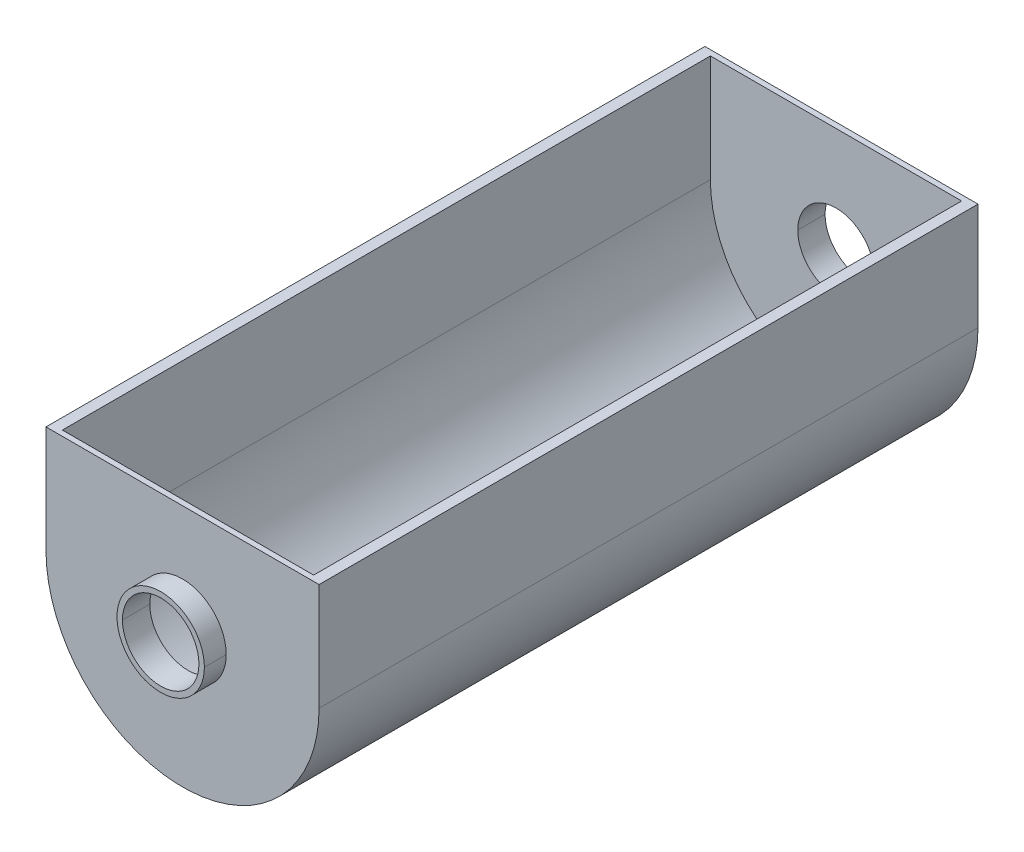
ISO-10303-21;
HEADER;
FILE_DESCRIPTION(('STEP AP214'),'2;1');
FILE_NAME('part.step','',(''),(''),'','','');
FILE_SCHEMA(('AUTOMOTIVE_DESIGN { 1 0 10303 214 1 1 1 1 }'));
ENDSEC;
DATA;
#1=APPLICATION_CONTEXT('core data for automotive mechanical design processes');
#2=APPLICATION_PROTOCOL_DEFINITION('international standard','automotive_design',2000,#1);
#3=PRODUCT_CONTEXT('',#1,'mechanical');
#4=PRODUCT('Part','Part','',(#3));
#5=PRODUCT_RELATED_PRODUCT_CATEGORY('part','',(#4));
#6=PRODUCT_DEFINITION_FORMATION('','',#4);
#7=PRODUCT_DEFINITION_CONTEXT('part definition',#1,'design');
#8=PRODUCT_DEFINITION('design','',#6,#7);
#9=PRODUCT_DEFINITION_SHAPE('','',#8);
#10=(LENGTH_UNIT() NAMED_UNIT(*) SI_UNIT(.MILLI.,.METRE.));
#11=(NAMED_UNIT(*) PLANE_ANGLE_UNIT() SI_UNIT($,.RADIAN.));
#12=(NAMED_UNIT(*) SI_UNIT($,.STERADIAN.) SOLID_ANGLE_UNIT());
#13=UNCERTAINTY_MEASURE_WITH_UNIT(LENGTH_MEASURE(1.E-05),#10,'distance_accuracy_value','');
#14=(GEOMETRIC_REPRESENTATION_CONTEXT(3) GLOBAL_UNCERTAINTY_ASSIGNED_CONTEXT((#13)) GLOBAL_UNIT_ASSIGNED_CONTEXT((#10,
#11,#12)) REPRESENTATION_CONTEXT('',''));
#15=CARTESIAN_POINT('',(0.,0.,0.));
#16=DIRECTION('',(0.,0.,1.));
#17=DIRECTION('',(1.,0.,0.));
#18=AXIS2_PLACEMENT_3D('',#15,#16,#17);
#19=CARTESIAN_POINT('',(0.,0.,-603.25));
#20=DIRECTION('',(0.,0.,-1.));
#21=DIRECTION('',(0.,-1.,0.));
#22=AXIS2_PLACEMENT_3D('',#19,#20,#21);
#23=PLANE('',#22);
#24=CARTESIAN_POINT('',(0.,0.,-603.25));
#25=DIRECTION('',(0.,0.,-1.));
#26=DIRECTION('',(1.,0.,0.));
#27=AXIS2_PLACEMENT_3D('',#24,#25,#26);
#28=CIRCLE('',#27,40.);
#29=CARTESIAN_POINT('',(40.,0.,-603.25));
#30=VERTEX_POINT('',#29);
#31=CARTESIAN_POINT('',(-40.,0.,-603.25));
#32=VERTEX_POINT('',#31);
#33=EDGE_CURVE('E134',#30,#32,#28,.T.);
#34=ORIENTED_EDGE('',*,*,#33,.F.);
#35=CARTESIAN_POINT('',(0.,0.,-603.25));
#36=DIRECTION('',(0.,0.,-1.));
#37=DIRECTION('',(1.,0.,0.));
#38=AXIS2_PLACEMENT_3D('',#35,#36,#37);
#39=CIRCLE('',#38,40.);
#40=EDGE_CURVE('E112',#32,#30,#39,.T.);
#41=ORIENTED_EDGE('',*,*,#40,.F.);
#42=EDGE_LOOP('',(#34,#41));
#43=FACE_BOUND('',#42,.T.);
#44=DIRECTION('',(0.,-1.,0.));
#45=VECTOR('',#44,1.);
#46=CARTESIAN_POINT('',(125.,0.,-603.25));
#47=LINE('',#46,#45);
#48=CARTESIAN_POINT('',(125.,98.0396050857446,-603.25));
#49=VERTEX_POINT('',#48);
#50=CARTESIAN_POINT('',(125.,0.,-603.25));
#51=VERTEX_POINT('',#50);
#52=EDGE_CURVE('E196',#49,#51,#47,.T.);
#53=ORIENTED_EDGE('',*,*,#52,.T.);
#54=CARTESIAN_POINT('',(0.,0.,-603.25));
#55=DIRECTION('',(0.,0.,1.));
#56=DIRECTION('',(1.,0.,0.));
#57=AXIS2_PLACEMENT_3D('',#54,#55,#56);
#58=CIRCLE('',#57,125.);
#59=CARTESIAN_POINT('',(-125.,0.,-603.25));
#60=VERTEX_POINT('',#59);
#61=EDGE_CURVE('E175',#60,#51,#58,.T.);
#62=ORIENTED_EDGE('',*,*,#61,.F.);
#63=DIRECTION('',(0.,-1.,0.));
#64=VECTOR('',#63,1.);
#65=CARTESIAN_POINT('',(-125.,0.,-603.25));
#66=LINE('',#65,#64);
#67=CARTESIAN_POINT('',(-125.,98.0396050857446,-603.25));
#68=VERTEX_POINT('',#67);
#69=EDGE_CURVE('E206',#68,#60,#66,.T.);
#70=ORIENTED_EDGE('',*,*,#69,.F.);
#71=DIRECTION('',(1.,0.,0.));
#72=VECTOR('',#71,1.);
#73=CARTESIAN_POINT('',(0.,98.0396050857446,-603.25));
#74=LINE('',#73,#72);
#75=EDGE_CURVE('E203',#68,#49,#74,.T.);
#76=ORIENTED_EDGE('',*,*,#75,.T.);
#77=EDGE_LOOP('',(#53,#62,#70,#76));
#78=FACE_BOUND('',#77,.T.);
#79=ADVANCED_FACE('F15',(#43,#78),#23,.T.);
#80=CARTESIAN_POINT('',(0.,0.,-623.25));
#81=DIRECTION('',(0.,0.,-1.));
#82=DIRECTION('',(0.,-1.,0.));
#83=AXIS2_PLACEMENT_3D('',#80,#81,#82);
#84=PLANE('',#83);
#85=CARTESIAN_POINT('',(0.,0.,-623.25));
#86=DIRECTION('',(0.,0.,1.));
#87=DIRECTION('',(1.,0.,0.));
#88=AXIS2_PLACEMENT_3D('',#85,#86,#87);
#89=CIRCLE('',#88,35.);
#90=CARTESIAN_POINT('',(35.,0.,-623.25));
#91=VERTEX_POINT('',#90);
#92=CARTESIAN_POINT('',(-35.,0.,-623.25));
#93=VERTEX_POINT('',#92);
#94=EDGE_CURVE('E123',#91,#93,#89,.T.);
#95=ORIENTED_EDGE('',*,*,#94,.T.);
#96=CARTESIAN_POINT('',(0.,0.,-623.25));
#97=DIRECTION('',(0.,0.,1.));
#98=DIRECTION('',(1.,0.,0.));
#99=AXIS2_PLACEMENT_3D('',#96,#97,#98);
#100=CIRCLE('',#99,35.);
#101=EDGE_CURVE('E10',#93,#91,#100,.T.);
#102=ORIENTED_EDGE('',*,*,#101,.T.);
#103=EDGE_LOOP('',(#95,#102));
#104=FACE_BOUND('',#103,.T.);
#105=CARTESIAN_POINT('',(0.,0.,-623.25));
#106=DIRECTION('',(0.,0.,1.));
#107=DIRECTION('',(1.,0.,0.));
#108=AXIS2_PLACEMENT_3D('',#105,#106,#107);
#109=CIRCLE('',#108,40.);
#110=CARTESIAN_POINT('',(40.,0.,-623.25));
#111=VERTEX_POINT('',#110);
#112=CARTESIAN_POINT('',(-40.,0.,-623.25));
#113=VERTEX_POINT('',#112);
#114=EDGE_CURVE('E202',#111,#113,#109,.T.);
#115=ORIENTED_EDGE('',*,*,#114,.F.);
#116=CARTESIAN_POINT('',(0.,0.,-623.25));
#117=DIRECTION('',(0.,0.,1.));
#118=DIRECTION('',(1.,0.,0.));
#119=AXIS2_PLACEMENT_3D('',#116,#117,#118);
#120=CIRCLE('',#119,40.);
#121=EDGE_CURVE('E19',#113,#111,#120,.T.);
#122=ORIENTED_EDGE('',*,*,#121,.F.);
#123=EDGE_LOOP('',(#115,#122));
#124=FACE_BOUND('',#123,.T.);
#125=ADVANCED_FACE('F120',(#104,#124),#84,.T.);
#126=CARTESIAN_POINT('',(0.,0.,-598.25));
#127=DIRECTION('',(0.,0.,-1.));
#128=DIRECTION('',(1.,0.,0.));
#129=AXIS2_PLACEMENT_3D('',#126,#127,#128);
#130=CYLINDRICAL_SURFACE('',#129,35.);
#131=DIRECTION('',(0.,0.,-1.));
#132=VECTOR('',#131,1.);
#133=CARTESIAN_POINT('',(-35.,0.,-598.25));
#134=LINE('',#133,#132);
#135=CARTESIAN_POINT('',(-35.,0.,-598.25));
#136=VERTEX_POINT('',#135);
#137=EDGE_CURVE('E137',#136,#93,#134,.T.);
#138=ORIENTED_EDGE('',*,*,#137,.F.);
#139=CARTESIAN_POINT('',(0.,0.,-598.25));
#140=DIRECTION('',(0.,0.,1.));
#141=DIRECTION('',(1.,0.,0.));
#142=AXIS2_PLACEMENT_3D('',#139,#140,#141);
#143=CIRCLE('',#142,35.);
#144=CARTESIAN_POINT('',(35.,0.,-598.25));
#145=VERTEX_POINT('',#144);
#146=EDGE_CURVE('E26',#136,#145,#143,.T.);
#147=ORIENTED_EDGE('',*,*,#146,.T.);
#148=DIRECTION('',(0.,0.,-1.));
#149=VECTOR('',#148,1.);
#150=CARTESIAN_POINT('',(35.,0.,-598.25));
#151=LINE('',#150,#149);
#152=EDGE_CURVE('E128',#145,#91,#151,.T.);
#153=ORIENTED_EDGE('',*,*,#152,.T.);
#154=ORIENTED_EDGE('',*,*,#101,.F.);
#155=EDGE_LOOP('',(#138,#147,#153,#154));
#156=FACE_BOUND('',#155,.T.);
#157=ADVANCED_FACE('F129',(#156),#130,.F.);
#158=CARTESIAN_POINT('',(0.,0.,-598.25));
#159=DIRECTION('',(0.,0.,-1.));
#160=DIRECTION('',(0.,-1.,0.));
#161=AXIS2_PLACEMENT_3D('',#158,#159,#160);
#162=PLANE('',#161);
#163=CARTESIAN_POINT('',(0.,0.,-598.25));
#164=DIRECTION('',(0.,0.,1.));
#165=DIRECTION('',(1.,0.,0.));
#166=AXIS2_PLACEMENT_3D('',#163,#164,#165);
#167=CIRCLE('',#166,35.);
#168=EDGE_CURVE('E144',#145,#136,#167,.T.);
#169=ORIENTED_EDGE('',*,*,#168,.F.);
#170=ORIENTED_EDGE('',*,*,#146,.F.);
#171=EDGE_LOOP('',(#169,#170));
#172=FACE_BOUND('',#171,.T.);
#173=DIRECTION('',(0.,-1.,0.));
#174=VECTOR('',#173,1.);
#175=CARTESIAN_POINT('',(115.,0.,-598.25));
#176=LINE('',#175,#174);
#177=CARTESIAN_POINT('',(115.,98.0396050857446,-598.25));
#178=VERTEX_POINT('',#177);
#179=CARTESIAN_POINT('',(115.,0.,-598.25));
#180=VERTEX_POINT('',#179);
#181=EDGE_CURVE('E164',#178,#180,#176,.T.);
#182=ORIENTED_EDGE('',*,*,#181,.F.);
#183=DIRECTION('',(1.,0.,0.));
#184=VECTOR('',#183,1.);
#185=CARTESIAN_POINT('',(0.,98.0396050857446,-598.25));
#186=LINE('',#185,#184);
#187=CARTESIAN_POINT('',(-115.,98.0396050857446,-598.25));
#188=VERTEX_POINT('',#187);
#189=EDGE_CURVE('E154',#188,#178,#186,.T.);
#190=ORIENTED_EDGE('',*,*,#189,.F.);
#191=DIRECTION('',(0.,1.,0.));
#192=VECTOR('',#191,1.);
#193=CARTESIAN_POINT('',(-115.,0.,-598.25));
#194=LINE('',#193,#192);
#195=CARTESIAN_POINT('',(-115.,0.,-598.25));
#196=VERTEX_POINT('',#195);
#197=EDGE_CURVE('E160',#196,#188,#194,.T.);
#198=ORIENTED_EDGE('',*,*,#197,.F.);
#199=CARTESIAN_POINT('',(0.,0.,-598.25));
#200=DIRECTION('',(0.,0.,-1.));
#201=DIRECTION('',(-1.,0.,0.));
#202=AXIS2_PLACEMENT_3D('',#199,#200,#201);
#203=CIRCLE('',#202,115.);
#204=EDGE_CURVE('E41',#180,#196,#203,.T.);
#205=ORIENTED_EDGE('',*,*,#204,.F.);
#206=EDGE_LOOP('',(#182,#190,#198,#205));
#207=FACE_BOUND('',#206,.T.);
#208=ADVANCED_FACE('F358',(#172,#207),#162,.F.);
#209=CARTESIAN_POINT('',(0.,0.,-598.25));
#210=DIRECTION('',(0.,0.,-1.));
#211=DIRECTION('',(1.,0.,0.));
#212=AXIS2_PLACEMENT_3D('',#209,#210,#211);
#213=CYLINDRICAL_SURFACE('',#212,40.);
#214=DIRECTION('',(0.,0.,-1.));
#215=VECTOR('',#214,1.);
#216=CARTESIAN_POINT('',(-40.,0.,-598.25));
#217=LINE('',#216,#215);
#218=EDGE_CURVE('E220',#32,#113,#217,.T.);
#219=ORIENTED_EDGE('',*,*,#218,.F.);
#220=ORIENTED_EDGE('',*,*,#40,.T.);
#221=DIRECTION('',(0.,0.,-1.));
#222=VECTOR('',#221,1.);
#223=CARTESIAN_POINT('',(40.,0.,-598.25));
#224=LINE('',#223,#222);
#225=EDGE_CURVE('E150',#30,#111,#224,.T.);
#226=ORIENTED_EDGE('',*,*,#225,.T.);
#227=ORIENTED_EDGE('',*,*,#114,.T.);
#228=EDGE_LOOP('',(#219,#220,#226,#227));
#229=FACE_BOUND('',#228,.T.);
#230=ADVANCED_FACE('F397',(#229),#213,.T.);
#231=CARTESIAN_POINT('',(0.,0.,-933.282334912326));
#232=DIRECTION('',(0.,0.,1.));
#233=DIRECTION('',(1.,0.,0.));
#234=AXIS2_PLACEMENT_3D('',#231,#232,#233);
#235=CYLINDRICAL_SURFACE('',#234,115.);
#236=DIRECTION('',(0.,0.,1.));
#237=VECTOR('',#236,1.);
#238=CARTESIAN_POINT('',(115.,0.,-933.282334912326));
#239=LINE('',#238,#237);
#240=CARTESIAN_POINT('',(115.,0.,-5.));
#241=VERTEX_POINT('',#240);
#242=EDGE_CURVE('E181',#180,#241,#239,.T.);
#243=ORIENTED_EDGE('',*,*,#242,.F.);
#244=ORIENTED_EDGE('',*,*,#204,.T.);
#245=DIRECTION('',(0.,0.,1.));
#246=VECTOR('',#245,1.);
#247=CARTESIAN_POINT('',(-115.,0.,-933.282334912326));
#248=LINE('',#247,#246);
#249=CARTESIAN_POINT('',(-115.,0.,-5.));
#250=VERTEX_POINT('',#249);
#251=EDGE_CURVE('E165',#196,#250,#248,.T.);
#252=ORIENTED_EDGE('',*,*,#251,.T.);
#253=CARTESIAN_POINT('',(0.,0.,-5.));
#254=DIRECTION('',(0.,0.,-1.));
#255=DIRECTION('',(-1.,0.,0.));
#256=AXIS2_PLACEMENT_3D('',#253,#254,#255);
#257=CIRCLE('',#256,115.);
#258=EDGE_CURVE('E265',#241,#250,#257,.T.);
#259=ORIENTED_EDGE('',*,*,#258,.F.);
#260=EDGE_LOOP('',(#243,#244,#252,#259));
#261=FACE_BOUND('',#260,.T.);
#262=ADVANCED_FACE('F428',(#261),#235,.F.);
#263=CARTESIAN_POINT('',(115.,0.,-933.282334912326));
#264=DIRECTION('',(-1.,0.,0.));
#265=DIRECTION('',(0.,0.,1.));
#266=AXIS2_PLACEMENT_3D('',#263,#264,#265);
#267=PLANE('',#266);
#268=DIRECTION('',(0.,0.,1.));
#269=VECTOR('',#268,1.);
#270=CARTESIAN_POINT('',(115.,98.0396050857446,-933.282334912326));
#271=LINE('',#270,#269);
#272=CARTESIAN_POINT('',(115.,98.0396050857446,-5.));
#273=VERTEX_POINT('',#272);
#274=EDGE_CURVE('E158',#178,#273,#271,.T.);
#275=ORIENTED_EDGE('',*,*,#274,.F.);
#276=ORIENTED_EDGE('',*,*,#181,.T.);
#277=ORIENTED_EDGE('',*,*,#242,.T.);
#278=DIRECTION('',(0.,-1.,0.));
#279=VECTOR('',#278,1.);
#280=CARTESIAN_POINT('',(115.,0.,-5.));
#281=LINE('',#280,#279);
#282=EDGE_CURVE('E174',#273,#241,#281,.T.);
#283=ORIENTED_EDGE('',*,*,#282,.F.);
#284=EDGE_LOOP('',(#275,#276,#277,#283));
#285=FACE_BOUND('',#284,.T.);
#286=ADVANCED_FACE('F362',(#285),#267,.T.);
#287=CARTESIAN_POINT('',(-115.,0.,-933.282334912326));
#288=DIRECTION('',(1.,0.,0.));
#289=DIRECTION('',(0.,1.,0.));
#290=AXIS2_PLACEMENT_3D('',#287,#288,#289);
#291=PLANE('',#290);
#292=ORIENTED_EDGE('',*,*,#251,.F.);
#293=ORIENTED_EDGE('',*,*,#197,.T.);
#294=DIRECTION('',(0.,0.,1.));
#295=VECTOR('',#294,1.);
#296=CARTESIAN_POINT('',(-115.,98.0396050857446,-933.282334912326));
#297=LINE('',#296,#295);
#298=CARTESIAN_POINT('',(-115.,98.0396050857446,-5.));
#299=VERTEX_POINT('',#298);
#300=EDGE_CURVE('E227',#188,#299,#297,.T.);
#301=ORIENTED_EDGE('',*,*,#300,.T.);
#302=DIRECTION('',(0.,1.,0.));
#303=VECTOR('',#302,1.);
#304=CARTESIAN_POINT('',(-115.,0.,-5.));
#305=LINE('',#304,#303);
#306=EDGE_CURVE('E148',#250,#299,#305,.T.);
#307=ORIENTED_EDGE('',*,*,#306,.F.);
#308=EDGE_LOOP('',(#292,#293,#301,#307));
#309=FACE_BOUND('',#308,.T.);
#310=ADVANCED_FACE('F350',(#309),#291,.T.);
#311=CARTESIAN_POINT('',(0.,0.,0.));
#312=DIRECTION('',(0.,0.,1.));
#313=DIRECTION('',(1.,0.,0.));
#314=AXIS2_PLACEMENT_3D('',#311,#312,#313);
#315=PLANE('',#314);
#316=CARTESIAN_POINT('',(0.,0.,0.));
#317=DIRECTION('',(0.,0.,-1.));
#318=DIRECTION('',(1.,0.,0.));
#319=AXIS2_PLACEMENT_3D('',#316,#317,#318);
#320=CIRCLE('',#319,40.);
#321=CARTESIAN_POINT('',(40.,0.,0.));
#322=VERTEX_POINT('',#321);
#323=CARTESIAN_POINT('',(-40.,0.,0.));
#324=VERTEX_POINT('',#323);
#325=EDGE_CURVE('E251',#322,#324,#320,.T.);
#326=ORIENTED_EDGE('',*,*,#325,.T.);
#327=CARTESIAN_POINT('',(0.,0.,0.));
#328=DIRECTION('',(0.,0.,-1.));
#329=DIRECTION('',(1.,0.,0.));
#330=AXIS2_PLACEMENT_3D('',#327,#328,#329);
#331=CIRCLE('',#330,40.);
#332=EDGE_CURVE('E237',#324,#322,#331,.T.);
#333=ORIENTED_EDGE('',*,*,#332,.T.);
#334=EDGE_LOOP('',(#326,#333));
#335=FACE_BOUND('',#334,.T.);
#336=DIRECTION('',(0.,-1.,0.));
#337=VECTOR('',#336,1.);
#338=CARTESIAN_POINT('',(125.,0.,0.));
#339=LINE('',#338,#337);
#340=CARTESIAN_POINT('',(125.,98.0396050857446,0.));
#341=VERTEX_POINT('',#340);
#342=CARTESIAN_POINT('',(125.,0.,0.));
#343=VERTEX_POINT('',#342);
#344=EDGE_CURVE('E185',#341,#343,#339,.T.);
#345=ORIENTED_EDGE('',*,*,#344,.F.);
#346=DIRECTION('',(1.,0.,0.));
#347=VECTOR('',#346,1.);
#348=CARTESIAN_POINT('',(0.,98.0396050857446,0.));
#349=LINE('',#348,#347);
#350=CARTESIAN_POINT('',(-125.,98.0396050857446,0.));
#351=VERTEX_POINT('',#350);
#352=EDGE_CURVE('E159',#351,#341,#349,.T.);
#353=ORIENTED_EDGE('',*,*,#352,.F.);
#354=DIRECTION('',(0.,-1.,0.));
#355=VECTOR('',#354,1.);
#356=CARTESIAN_POINT('',(-125.,0.,0.));
#357=LINE('',#356,#355);
#358=CARTESIAN_POINT('',(-125.,0.,0.));
#359=VERTEX_POINT('',#358);
#360=EDGE_CURVE('E179',#351,#359,#357,.T.);
#361=ORIENTED_EDGE('',*,*,#360,.T.);
#362=CARTESIAN_POINT('',(0.,0.,0.));
#363=DIRECTION('',(0.,0.,1.));
#364=DIRECTION('',(1.,0.,0.));
#365=AXIS2_PLACEMENT_3D('',#362,#363,#364);
#366=CIRCLE('',#365,125.);
#367=EDGE_CURVE('E195',#359,#343,#366,.T.);
#368=ORIENTED_EDGE('',*,*,#367,.T.);
#369=EDGE_LOOP('',(#345,#353,#361,#368));
#370=FACE_BOUND('',#369,.T.);
#371=ADVANCED_FACE('F298',(#335,#370),#315,.T.);
#372=CARTESIAN_POINT('',(0.,98.0396050857446,-5.));
#373=DIRECTION('',(0.,-1.,0.));
#374=DIRECTION('',(0.,0.,-1.));
#375=AXIS2_PLACEMENT_3D('',#372,#373,#374);
#376=PLANE('',#375);
#377=ORIENTED_EDGE('',*,*,#189,.T.);
#378=ORIENTED_EDGE('',*,*,#274,.T.);
#379=DIRECTION('',(1.,0.,0.));
#380=VECTOR('',#379,1.);
#381=CARTESIAN_POINT('',(0.,98.0396050857446,-5.));
#382=LINE('',#381,#380);
#383=EDGE_CURVE('E170',#299,#273,#382,.T.);
#384=ORIENTED_EDGE('',*,*,#383,.F.);
#385=ORIENTED_EDGE('',*,*,#300,.F.);
#386=EDGE_LOOP('',(#377,#378,#384,#385));
#387=FACE_BOUND('',#386,.T.);
#388=DIRECTION('',(0.,0.,1.));
#389=VECTOR('',#388,1.);
#390=CARTESIAN_POINT('',(125.,98.0396050857446,-5.));
#391=LINE('',#390,#389);
#392=EDGE_CURVE('E191',#49,#341,#391,.T.);
#393=ORIENTED_EDGE('',*,*,#392,.F.);
#394=ORIENTED_EDGE('',*,*,#75,.F.);
#395=DIRECTION('',(0.,0.,1.));
#396=VECTOR('',#395,1.);
#397=CARTESIAN_POINT('',(-125.,98.0396050857446,-5.));
#398=LINE('',#397,#396);
#399=EDGE_CURVE('E224',#68,#351,#398,.T.);
#400=ORIENTED_EDGE('',*,*,#399,.T.);
#401=ORIENTED_EDGE('',*,*,#352,.T.);
#402=EDGE_LOOP('',(#393,#394,#400,#401));
#403=FACE_BOUND('',#402,.T.);
#404=ADVANCED_FACE('F17',(#387,#403),#376,.F.);
#405=CARTESIAN_POINT('',(-125.,0.,-5.));
#406=DIRECTION('',(-1.,0.,0.));
#407=DIRECTION('',(0.,0.,1.));
#408=AXIS2_PLACEMENT_3D('',#405,#406,#407);
#409=PLANE('',#408);
#410=ORIENTED_EDGE('',*,*,#360,.F.);
#411=ORIENTED_EDGE('',*,*,#399,.F.);
#412=ORIENTED_EDGE('',*,*,#69,.T.);
#413=DIRECTION('',(0.,0.,1.));
#414=VECTOR('',#413,1.);
#415=CARTESIAN_POINT('',(-125.,0.,-5.));
#416=LINE('',#415,#414);
#417=EDGE_CURVE('E180',#60,#359,#416,.T.);
#418=ORIENTED_EDGE('',*,*,#417,.T.);
#419=EDGE_LOOP('',(#410,#411,#412,#418));
#420=FACE_BOUND('',#419,.T.);
#421=ADVANCED_FACE('F383',(#420),#409,.T.);
#422=CARTESIAN_POINT('',(0.,0.,-5.));
#423=DIRECTION('',(0.,0.,1.));
#424=DIRECTION('',(1.,0.,0.));
#425=AXIS2_PLACEMENT_3D('',#422,#423,#424);
#426=CYLINDRICAL_SURFACE('',#425,125.);
#427=ORIENTED_EDGE('',*,*,#367,.F.);
#428=ORIENTED_EDGE('',*,*,#417,.F.);
#429=ORIENTED_EDGE('',*,*,#61,.T.);
#430=DIRECTION('',(0.,0.,1.));
#431=VECTOR('',#430,1.);
#432=CARTESIAN_POINT('',(125.,0.,-5.));
#433=LINE('',#432,#431);
#434=EDGE_CURVE('E189',#51,#343,#433,.T.);
#435=ORIENTED_EDGE('',*,*,#434,.T.);
#436=EDGE_LOOP('',(#427,#428,#429,#435));
#437=FACE_BOUND('',#436,.T.);
#438=ADVANCED_FACE('F305',(#437),#426,.T.);
#439=CARTESIAN_POINT('',(125.,0.,-5.));
#440=DIRECTION('',(-1.,0.,0.));
#441=DIRECTION('',(0.,0.,1.));
#442=AXIS2_PLACEMENT_3D('',#439,#440,#441);
#443=PLANE('',#442);
#444=ORIENTED_EDGE('',*,*,#344,.T.);
#445=ORIENTED_EDGE('',*,*,#434,.F.);
#446=ORIENTED_EDGE('',*,*,#52,.F.);
#447=ORIENTED_EDGE('',*,*,#392,.T.);
#448=EDGE_LOOP('',(#444,#445,#446,#447));
#449=FACE_BOUND('',#448,.T.);
#450=ADVANCED_FACE('F296',(#449),#443,.F.);
#451=CARTESIAN_POINT('',(0.,0.,20.));
#452=DIRECTION('',(0.,0.,1.));
#453=DIRECTION('',(1.,0.,0.));
#454=AXIS2_PLACEMENT_3D('',#451,#452,#453);
#455=PLANE('',#454);
#456=CARTESIAN_POINT('',(0.,0.,20.));
#457=DIRECTION('',(0.,0.,1.));
#458=DIRECTION('',(1.,0.,0.));
#459=AXIS2_PLACEMENT_3D('',#456,#457,#458);
#460=CIRCLE('',#459,35.);
#461=CARTESIAN_POINT('',(35.,0.,20.));
#462=VERTEX_POINT('',#461);
#463=CARTESIAN_POINT('',(-35.,0.,20.));
#464=VERTEX_POINT('',#463);
#465=EDGE_CURVE('E190',#462,#464,#460,.T.);
#466=ORIENTED_EDGE('',*,*,#465,.F.);
#467=CARTESIAN_POINT('',(0.,0.,20.));
#468=DIRECTION('',(0.,0.,1.));
#469=DIRECTION('',(1.,0.,0.));
#470=AXIS2_PLACEMENT_3D('',#467,#468,#469);
#471=CIRCLE('',#470,35.);
#472=EDGE_CURVE('E213',#464,#462,#471,.T.);
#473=ORIENTED_EDGE('',*,*,#472,.F.);
#474=EDGE_LOOP('',(#466,#473));
#475=FACE_BOUND('',#474,.T.);
#476=CARTESIAN_POINT('',(0.,0.,20.));
#477=DIRECTION('',(0.,0.,1.));
#478=DIRECTION('',(1.,0.,0.));
#479=AXIS2_PLACEMENT_3D('',#476,#477,#478);
#480=CIRCLE('',#479,40.);
#481=CARTESIAN_POINT('',(40.,0.,20.));
#482=VERTEX_POINT('',#481);
#483=CARTESIAN_POINT('',(-40.,0.,20.));
#484=VERTEX_POINT('',#483);
#485=EDGE_CURVE('E236',#482,#484,#480,.T.);
#486=ORIENTED_EDGE('',*,*,#485,.T.);
#487=CARTESIAN_POINT('',(0.,0.,20.));
#488=DIRECTION('',(0.,0.,1.));
#489=DIRECTION('',(1.,0.,0.));
#490=AXIS2_PLACEMENT_3D('',#487,#488,#489);
#491=CIRCLE('',#490,40.);
#492=EDGE_CURVE('E255',#484,#482,#491,.T.);
#493=ORIENTED_EDGE('',*,*,#492,.T.);
#494=EDGE_LOOP('',(#486,#493));
#495=FACE_BOUND('',#494,.T.);
#496=ADVANCED_FACE('F403',(#475,#495),#455,.T.);
#497=CARTESIAN_POINT('',(0.,0.,-5.));
#498=DIRECTION('',(0.,0.,1.));
#499=DIRECTION('',(1.,0.,0.));
#500=AXIS2_PLACEMENT_3D('',#497,#498,#499);
#501=CYLINDRICAL_SURFACE('',#500,35.);
#502=DIRECTION('',(0.,0.,1.));
#503=VECTOR('',#502,1.);
#504=CARTESIAN_POINT('',(-35.,0.,-5.));
#505=LINE('',#504,#503);
#506=CARTESIAN_POINT('',(-35.,0.,-5.));
#507=VERTEX_POINT('',#506);
#508=EDGE_CURVE('E169',#507,#464,#505,.T.);
#509=ORIENTED_EDGE('',*,*,#508,.F.);
#510=CARTESIAN_POINT('',(0.,0.,-5.));
#511=DIRECTION('',(0.,0.,1.));
#512=DIRECTION('',(1.,0.,0.));
#513=AXIS2_PLACEMENT_3D('',#510,#511,#512);
#514=CIRCLE('',#513,35.);
#515=CARTESIAN_POINT('',(35.,0.,-5.));
#516=VERTEX_POINT('',#515);
#517=EDGE_CURVE('E269',#516,#507,#514,.T.);
#518=ORIENTED_EDGE('',*,*,#517,.F.);
#519=DIRECTION('',(0.,0.,1.));
#520=VECTOR('',#519,1.);
#521=CARTESIAN_POINT('',(35.,0.,-5.));
#522=LINE('',#521,#520);
#523=EDGE_CURVE('E231',#516,#462,#522,.T.);
#524=ORIENTED_EDGE('',*,*,#523,.T.);
#525=ORIENTED_EDGE('',*,*,#465,.T.);
#526=EDGE_LOOP('',(#509,#518,#524,#525));
#527=FACE_BOUND('',#526,.T.);
#528=ADVANCED_FACE('F406',(#527),#501,.F.);
#529=CARTESIAN_POINT('',(0.,0.,-5.));
#530=DIRECTION('',(0.,0.,1.));
#531=DIRECTION('',(1.,0.,0.));
#532=AXIS2_PLACEMENT_3D('',#529,#530,#531);
#533=PLANE('',#532);
#534=ORIENTED_EDGE('',*,*,#517,.T.);
#535=CARTESIAN_POINT('',(0.,0.,-5.));
#536=DIRECTION('',(0.,0.,1.));
#537=DIRECTION('',(1.,0.,0.));
#538=AXIS2_PLACEMENT_3D('',#535,#536,#537);
#539=CIRCLE('',#538,35.);
#540=EDGE_CURVE('E152',#507,#516,#539,.T.);
#541=ORIENTED_EDGE('',*,*,#540,.T.);
#542=EDGE_LOOP('',(#534,#541));
#543=FACE_BOUND('',#542,.T.);
#544=ORIENTED_EDGE('',*,*,#258,.T.);
#545=ORIENTED_EDGE('',*,*,#306,.T.);
#546=ORIENTED_EDGE('',*,*,#383,.T.);
#547=ORIENTED_EDGE('',*,*,#282,.T.);
#548=EDGE_LOOP('',(#544,#545,#546,#547));
#549=FACE_BOUND('',#548,.T.);
#550=ADVANCED_FACE('F411',(#543,#549),#533,.F.);
#551=CARTESIAN_POINT('',(0.,0.,-5.));
#552=DIRECTION('',(0.,0.,1.));
#553=DIRECTION('',(1.,0.,0.));
#554=AXIS2_PLACEMENT_3D('',#551,#552,#553);
#555=CYLINDRICAL_SURFACE('',#554,40.);
#556=DIRECTION('',(0.,0.,1.));
#557=VECTOR('',#556,1.);
#558=CARTESIAN_POINT('',(-40.,0.,-5.));
#559=LINE('',#558,#557);
#560=EDGE_CURVE('E232',#324,#484,#559,.T.);
#561=ORIENTED_EDGE('',*,*,#560,.F.);
#562=ORIENTED_EDGE('',*,*,#325,.F.);
#563=DIRECTION('',(0.,0.,1.));
#564=VECTOR('',#563,1.);
#565=CARTESIAN_POINT('',(40.,0.,-5.));
#566=LINE('',#565,#564);
#567=EDGE_CURVE('E250',#322,#482,#566,.T.);
#568=ORIENTED_EDGE('',*,*,#567,.T.);
#569=ORIENTED_EDGE('',*,*,#492,.F.);
#570=EDGE_LOOP('',(#561,#562,#568,#569));
#571=FACE_BOUND('',#570,.T.);
#572=ADVANCED_FACE('F414',(#571),#555,.T.);
#573=CARTESIAN_POINT('',(0.,0.,-5.));
#574=DIRECTION('',(0.,0.,1.));
#575=DIRECTION('',(1.,0.,0.));
#576=AXIS2_PLACEMENT_3D('',#573,#574,#575);
#577=CYLINDRICAL_SURFACE('',#576,40.);
#578=ORIENTED_EDGE('',*,*,#332,.F.);
#579=ORIENTED_EDGE('',*,*,#560,.T.);
#580=ORIENTED_EDGE('',*,*,#485,.F.);
#581=ORIENTED_EDGE('',*,*,#567,.F.);
#582=EDGE_LOOP('',(#578,#579,#580,#581));
#583=FACE_BOUND('',#582,.T.);
#584=ADVANCED_FACE('F421',(#583),#577,.T.);
#585=CARTESIAN_POINT('',(0.,0.,-5.));
#586=DIRECTION('',(0.,0.,1.));
#587=DIRECTION('',(1.,0.,0.));
#588=AXIS2_PLACEMENT_3D('',#585,#586,#587);
#589=CYLINDRICAL_SURFACE('',#588,35.);
#590=ORIENTED_EDGE('',*,*,#540,.F.);
#591=ORIENTED_EDGE('',*,*,#508,.T.);
#592=ORIENTED_EDGE('',*,*,#472,.T.);
#593=ORIENTED_EDGE('',*,*,#523,.F.);
#594=EDGE_LOOP('',(#590,#591,#592,#593));
#595=FACE_BOUND('',#594,.T.);
#596=ADVANCED_FACE('F418',(#595),#589,.F.);
#597=CARTESIAN_POINT('',(0.,0.,-598.25));
#598=DIRECTION('',(0.,0.,-1.));
#599=DIRECTION('',(1.,0.,0.));
#600=AXIS2_PLACEMENT_3D('',#597,#598,#599);
#601=CYLINDRICAL_SURFACE('',#600,40.);
#602=ORIENTED_EDGE('',*,*,#33,.T.);
#603=ORIENTED_EDGE('',*,*,#218,.T.);
#604=ORIENTED_EDGE('',*,*,#121,.T.);
#605=ORIENTED_EDGE('',*,*,#225,.F.);
#606=EDGE_LOOP('',(#602,#603,#604,#605));
#607=FACE_BOUND('',#606,.T.);
#608=ADVANCED_FACE('F410',(#607),#601,.T.);
#609=CARTESIAN_POINT('',(0.,0.,-598.25));
#610=DIRECTION('',(0.,0.,-1.));
#611=DIRECTION('',(1.,0.,0.));
#612=AXIS2_PLACEMENT_3D('',#609,#610,#611);
#613=CYLINDRICAL_SURFACE('',#612,35.);
#614=ORIENTED_EDGE('',*,*,#168,.T.);
#615=ORIENTED_EDGE('',*,*,#137,.T.);
#616=ORIENTED_EDGE('',*,*,#94,.F.);
#617=ORIENTED_EDGE('',*,*,#152,.F.);
#618=EDGE_LOOP('',(#614,#615,#616,#617));
#619=FACE_BOUND('',#618,.T.);
#620=ADVANCED_FACE('F136',(#619),#613,.F.);
#621=CLOSED_SHELL('',(#79,#125,#157,#208,#230,#262,#286,#310,#371,#404,#421,#438,#450,#496,#528,
#550,#572,#584,#596,#608,#620));
#622=MANIFOLD_SOLID_BREP('B1',#621);
#623=ADVANCED_BREP_SHAPE_REPRESENTATION('',(#18,#622),#14);
#624=SHAPE_DEFINITION_REPRESENTATION(#9,#623);
ENDSEC;
END-ISO-10303-21;
